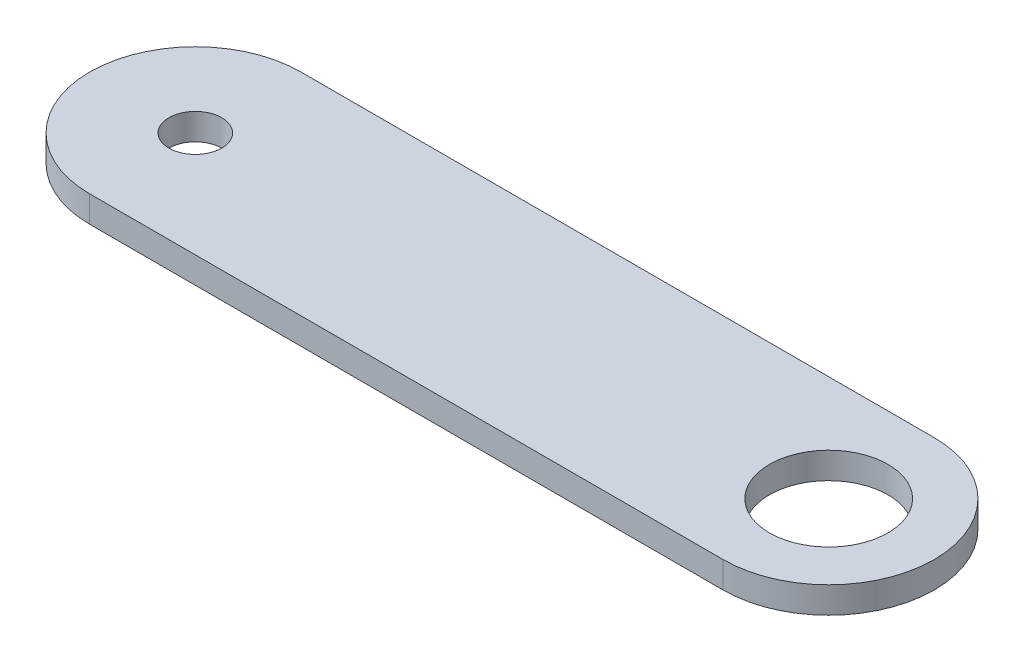
ISO-10303-21;
HEADER;
FILE_DESCRIPTION(('STEP AP214'),'2;1');
FILE_NAME('part.step','',(''),(''),'','','');
FILE_SCHEMA(('AUTOMOTIVE_DESIGN { 1 0 10303 214 1 1 1 1 }'));
ENDSEC;
DATA;
#1=APPLICATION_CONTEXT('core data for automotive mechanical design processes');
#2=APPLICATION_PROTOCOL_DEFINITION('international standard','automotive_design',2000,#1);
#3=PRODUCT_CONTEXT('',#1,'mechanical');
#4=PRODUCT('Part','Part','',(#3));
#5=PRODUCT_RELATED_PRODUCT_CATEGORY('part','',(#4));
#6=PRODUCT_DEFINITION_FORMATION('','',#4);
#7=PRODUCT_DEFINITION_CONTEXT('part definition',#1,'design');
#8=PRODUCT_DEFINITION('design','',#6,#7);
#9=PRODUCT_DEFINITION_SHAPE('','',#8);
#10=(LENGTH_UNIT() NAMED_UNIT(*) SI_UNIT(.MILLI.,.METRE.));
#11=(NAMED_UNIT(*) PLANE_ANGLE_UNIT() SI_UNIT($,.RADIAN.));
#12=(NAMED_UNIT(*) SI_UNIT($,.STERADIAN.) SOLID_ANGLE_UNIT());
#13=UNCERTAINTY_MEASURE_WITH_UNIT(LENGTH_MEASURE(1.E-05),#10,'distance_accuracy_value','');
#14=(GEOMETRIC_REPRESENTATION_CONTEXT(3) GLOBAL_UNCERTAINTY_ASSIGNED_CONTEXT((#13)) GLOBAL_UNIT_ASSIGNED_CONTEXT((#10,
#11,#12)) REPRESENTATION_CONTEXT('',''));
#15=CARTESIAN_POINT('',(0.,0.,0.));
#16=DIRECTION('',(0.,0.,1.));
#17=DIRECTION('',(1.,0.,0.));
#18=AXIS2_PLACEMENT_3D('',#15,#16,#17);
#19=CARTESIAN_POINT('',(19.05,1.5875,0.));
#20=DIRECTION('',(0.,1.,0.));
#21=DIRECTION('',(0.,0.,1.));
#22=AXIS2_PLACEMENT_3D('',#19,#20,#21);
#23=PLANE('',#22);
#24=CARTESIAN_POINT('',(-19.05,1.5875,0.));
#25=DIRECTION('',(0.,1.,0.));
#26=DIRECTION('',(0.,0.,1.));
#27=AXIS2_PLACEMENT_3D('',#24,#25,#26);
#28=CIRCLE('',#27,1.5875);
#29=CARTESIAN_POINT('',(-19.05,1.5875,1.58750000000001));
#30=VERTEX_POINT('',#29);
#31=EDGE_CURVE('E102',#30,#30,#28,.T.);
#32=ORIENTED_EDGE('',*,*,#31,.F.);
#33=EDGE_LOOP('',(#32));
#34=FACE_BOUND('',#33,.T.);
#35=CARTESIAN_POINT('',(19.05,1.5875,0.));
#36=DIRECTION('',(0.,1.,0.));
#37=DIRECTION('',(0.,0.,1.));
#38=AXIS2_PLACEMENT_3D('',#35,#36,#37);
#39=CIRCLE('',#38,6.35);
#40=CARTESIAN_POINT('',(19.05,1.5875,6.35));
#41=VERTEX_POINT('',#40);
#42=CARTESIAN_POINT('',(19.05,1.5875,-6.35000000000001));
#43=VERTEX_POINT('',#42);
#44=EDGE_CURVE('E87',#41,#43,#39,.T.);
#45=ORIENTED_EDGE('',*,*,#44,.T.);
#46=DIRECTION('',(-1.,0.,0.));
#47=VECTOR('',#46,1.);
#48=CARTESIAN_POINT('',(19.05,1.5875,-6.35000000000001));
#49=LINE('',#48,#47);
#50=CARTESIAN_POINT('',(-19.05,1.5875,-6.35));
#51=VERTEX_POINT('',#50);
#52=EDGE_CURVE('E82',#43,#51,#49,.T.);
#53=ORIENTED_EDGE('',*,*,#52,.T.);
#54=CARTESIAN_POINT('',(-19.05,1.5875,0.));
#55=DIRECTION('',(0.,1.,0.));
#56=DIRECTION('',(0.,0.,1.));
#57=AXIS2_PLACEMENT_3D('',#54,#55,#56);
#58=CIRCLE('',#57,6.35);
#59=CARTESIAN_POINT('',(-19.05,1.5875,6.35000000000001));
#60=VERTEX_POINT('',#59);
#61=EDGE_CURVE('E85',#51,#60,#58,.T.);
#62=ORIENTED_EDGE('',*,*,#61,.T.);
#63=DIRECTION('',(1.,0.,0.));
#64=VECTOR('',#63,1.);
#65=CARTESIAN_POINT('',(19.05,1.5875,6.35));
#66=LINE('',#65,#64);
#67=EDGE_CURVE('E52',#60,#41,#66,.T.);
#68=ORIENTED_EDGE('',*,*,#67,.T.);
#69=EDGE_LOOP('',(#45,#53,#62,#68));
#70=FACE_BOUND('',#69,.T.);
#71=CARTESIAN_POINT('',(19.05,1.5875,0.));
#72=DIRECTION('',(0.,1.,0.));
#73=DIRECTION('',(0.,0.,1.));
#74=AXIS2_PLACEMENT_3D('',#71,#72,#73);
#75=CIRCLE('',#74,3.5687);
#76=CARTESIAN_POINT('',(19.05,1.5875,3.56869999999999));
#77=VERTEX_POINT('',#76);
#78=EDGE_CURVE('E117',#77,#77,#75,.T.);
#79=ORIENTED_EDGE('',*,*,#78,.F.);
#80=EDGE_LOOP('',(#79));
#81=FACE_BOUND('',#80,.T.);
#82=ADVANCED_FACE('F35',(#34,#70,#81),#23,.T.);
#83=CARTESIAN_POINT('',(19.05,0.,0.));
#84=DIRECTION('',(0.,1.,0.));
#85=DIRECTION('',(0.,0.,1.));
#86=AXIS2_PLACEMENT_3D('',#83,#84,#85);
#87=PLANE('',#86);
#88=CARTESIAN_POINT('',(19.05,0.,0.));
#89=DIRECTION('',(0.,1.,0.));
#90=DIRECTION('',(0.,0.,1.));
#91=AXIS2_PLACEMENT_3D('',#88,#89,#90);
#92=CIRCLE('',#91,6.35);
#93=CARTESIAN_POINT('',(19.05,0.,6.35));
#94=VERTEX_POINT('',#93);
#95=CARTESIAN_POINT('',(19.05,0.,-6.35000000000001));
#96=VERTEX_POINT('',#95);
#97=EDGE_CURVE('E99',#94,#96,#92,.T.);
#98=ORIENTED_EDGE('',*,*,#97,.F.);
#99=DIRECTION('',(1.,0.,0.));
#100=VECTOR('',#99,1.);
#101=CARTESIAN_POINT('',(19.05,0.,6.35));
#102=LINE('',#101,#100);
#103=CARTESIAN_POINT('',(-19.05,0.,6.35000000000001));
#104=VERTEX_POINT('',#103);
#105=EDGE_CURVE('E75',#104,#94,#102,.T.);
#106=ORIENTED_EDGE('',*,*,#105,.F.);
#107=CARTESIAN_POINT('',(-19.05,0.,0.));
#108=DIRECTION('',(0.,1.,0.));
#109=DIRECTION('',(0.,0.,1.));
#110=AXIS2_PLACEMENT_3D('',#107,#108,#109);
#111=CIRCLE('',#110,6.35);
#112=CARTESIAN_POINT('',(-19.05,0.,-6.35));
#113=VERTEX_POINT('',#112);
#114=EDGE_CURVE('E69',#113,#104,#111,.T.);
#115=ORIENTED_EDGE('',*,*,#114,.F.);
#116=DIRECTION('',(-1.,0.,0.));
#117=VECTOR('',#116,1.);
#118=CARTESIAN_POINT('',(19.05,0.,-6.35000000000001));
#119=LINE('',#118,#117);
#120=EDGE_CURVE('E91',#96,#113,#119,.T.);
#121=ORIENTED_EDGE('',*,*,#120,.F.);
#122=EDGE_LOOP('',(#98,#106,#115,#121));
#123=FACE_BOUND('',#122,.T.);
#124=CARTESIAN_POINT('',(-19.05,0.,0.));
#125=DIRECTION('',(0.,1.,0.));
#126=DIRECTION('',(0.,0.,1.));
#127=AXIS2_PLACEMENT_3D('',#124,#125,#126);
#128=CIRCLE('',#127,1.5875);
#129=CARTESIAN_POINT('',(-19.05,0.,1.58750000000001));
#130=VERTEX_POINT('',#129);
#131=EDGE_CURVE('E114',#130,#130,#128,.T.);
#132=ORIENTED_EDGE('',*,*,#131,.T.);
#133=EDGE_LOOP('',(#132));
#134=FACE_BOUND('',#133,.T.);
#135=CARTESIAN_POINT('',(19.05,0.,0.));
#136=DIRECTION('',(0.,1.,0.));
#137=DIRECTION('',(0.,0.,1.));
#138=AXIS2_PLACEMENT_3D('',#135,#136,#137);
#139=CIRCLE('',#138,3.5687);
#140=CARTESIAN_POINT('',(19.05,0.,3.56869999999999));
#141=VERTEX_POINT('',#140);
#142=EDGE_CURVE('E120',#141,#141,#139,.T.);
#143=ORIENTED_EDGE('',*,*,#142,.T.);
#144=EDGE_LOOP('',(#143));
#145=FACE_BOUND('',#144,.T.);
#146=ADVANCED_FACE('F110',(#123,#134,#145),#87,.F.);
#147=CARTESIAN_POINT('',(19.05,1.5875,0.));
#148=DIRECTION('',(0.,-1.,0.));
#149=DIRECTION('',(0.,0.,-1.));
#150=AXIS2_PLACEMENT_3D('',#147,#148,#149);
#151=CYLINDRICAL_SURFACE('',#150,6.35);
#152=ORIENTED_EDGE('',*,*,#97,.T.);
#153=DIRECTION('',(0.,-1.,0.));
#154=VECTOR('',#153,1.);
#155=CARTESIAN_POINT('',(19.05,1.5875,-6.35000000000001));
#156=LINE('',#155,#154);
#157=EDGE_CURVE('E11',#43,#96,#156,.T.);
#158=ORIENTED_EDGE('',*,*,#157,.F.);
#159=ORIENTED_EDGE('',*,*,#44,.F.);
#160=DIRECTION('',(0.,-1.,0.));
#161=VECTOR('',#160,1.);
#162=CARTESIAN_POINT('',(19.05,1.5875,6.35));
#163=LINE('',#162,#161);
#164=EDGE_CURVE('E95',#41,#94,#163,.T.);
#165=ORIENTED_EDGE('',*,*,#164,.T.);
#166=EDGE_LOOP('',(#152,#158,#159,#165));
#167=FACE_BOUND('',#166,.T.);
#168=ADVANCED_FACE('F37',(#167),#151,.T.);
#169=CARTESIAN_POINT('',(19.05,1.5875,-6.35000000000001));
#170=DIRECTION('',(0.,0.,1.));
#171=DIRECTION('',(1.,0.,0.));
#172=AXIS2_PLACEMENT_3D('',#169,#170,#171);
#173=PLANE('',#172);
#174=ORIENTED_EDGE('',*,*,#120,.T.);
#175=DIRECTION('',(0.,-1.,0.));
#176=VECTOR('',#175,1.);
#177=CARTESIAN_POINT('',(-19.05,1.5875,-6.35));
#178=LINE('',#177,#176);
#179=EDGE_CURVE('E44',#51,#113,#178,.T.);
#180=ORIENTED_EDGE('',*,*,#179,.F.);
#181=ORIENTED_EDGE('',*,*,#52,.F.);
#182=ORIENTED_EDGE('',*,*,#157,.T.);
#183=EDGE_LOOP('',(#174,#180,#181,#182));
#184=FACE_BOUND('',#183,.T.);
#185=ADVANCED_FACE('F90',(#184),#173,.F.);
#186=CARTESIAN_POINT('',(-19.05,1.5875,0.));
#187=DIRECTION('',(0.,-1.,0.));
#188=DIRECTION('',(0.,0.,-1.));
#189=AXIS2_PLACEMENT_3D('',#186,#187,#188);
#190=CYLINDRICAL_SURFACE('',#189,6.35);
#191=ORIENTED_EDGE('',*,*,#114,.T.);
#192=DIRECTION('',(0.,-1.,0.));
#193=VECTOR('',#192,1.);
#194=CARTESIAN_POINT('',(-19.05,1.5875,6.35000000000001));
#195=LINE('',#194,#193);
#196=EDGE_CURVE('E92',#60,#104,#195,.T.);
#197=ORIENTED_EDGE('',*,*,#196,.F.);
#198=ORIENTED_EDGE('',*,*,#61,.F.);
#199=ORIENTED_EDGE('',*,*,#179,.T.);
#200=EDGE_LOOP('',(#191,#197,#198,#199));
#201=FACE_BOUND('',#200,.T.);
#202=ADVANCED_FACE('F93',(#201),#190,.T.);
#203=CARTESIAN_POINT('',(19.05,1.5875,6.35));
#204=DIRECTION('',(0.,0.,-1.));
#205=DIRECTION('',(-1.,0.,0.));
#206=AXIS2_PLACEMENT_3D('',#203,#204,#205);
#207=PLANE('',#206);
#208=ORIENTED_EDGE('',*,*,#105,.T.);
#209=ORIENTED_EDGE('',*,*,#164,.F.);
#210=ORIENTED_EDGE('',*,*,#67,.F.);
#211=ORIENTED_EDGE('',*,*,#196,.T.);
#212=EDGE_LOOP('',(#208,#209,#210,#211));
#213=FACE_BOUND('',#212,.T.);
#214=ADVANCED_FACE('F107',(#213),#207,.F.);
#215=CARTESIAN_POINT('',(-19.05,1.5875,0.));
#216=DIRECTION('',(0.,-1.,0.));
#217=DIRECTION('',(0.,0.,-1.));
#218=AXIS2_PLACEMENT_3D('',#215,#216,#217);
#219=CYLINDRICAL_SURFACE('',#218,1.5875);
#220=ORIENTED_EDGE('',*,*,#31,.T.);
#221=EDGE_LOOP('',(#220));
#222=FACE_BOUND('',#221,.T.);
#223=ORIENTED_EDGE('',*,*,#131,.F.);
#224=EDGE_LOOP('',(#223));
#225=FACE_BOUND('',#224,.T.);
#226=ADVANCED_FACE('F137',(#222,#225),#219,.F.);
#227=CARTESIAN_POINT('',(19.05,1.5875,0.));
#228=DIRECTION('',(0.,-1.,0.));
#229=DIRECTION('',(0.,0.,-1.));
#230=AXIS2_PLACEMENT_3D('',#227,#228,#229);
#231=CYLINDRICAL_SURFACE('',#230,3.5687);
#232=ORIENTED_EDGE('',*,*,#78,.T.);
#233=EDGE_LOOP('',(#232));
#234=FACE_BOUND('',#233,.T.);
#235=ORIENTED_EDGE('',*,*,#142,.F.);
#236=EDGE_LOOP('',(#235));
#237=FACE_BOUND('',#236,.T.);
#238=ADVANCED_FACE('F126',(#234,#237),#231,.F.);
#239=CLOSED_SHELL('',(#82,#146,#168,#185,#202,#214,#226,#238));
#240=MANIFOLD_SOLID_BREP('B2',#239);
#241=ADVANCED_BREP_SHAPE_REPRESENTATION('',(#18,#240),#14);
#242=SHAPE_DEFINITION_REPRESENTATION(#9,#241);
ENDSEC;
END-ISO-10303-21;
